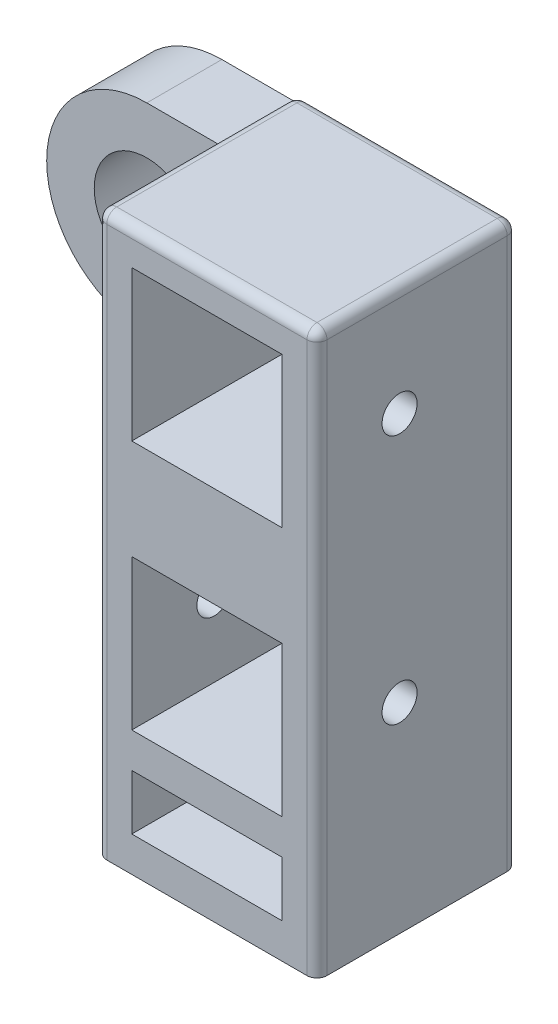
ISO-10303-21;
HEADER;
FILE_DESCRIPTION(('STEP AP214'),'2;1');
FILE_NAME('part.step','',(''),(''),'','','');
FILE_SCHEMA(('AUTOMOTIVE_DESIGN { 1 0 10303 214 1 1 1 1 }'));
ENDSEC;
DATA;
#1=APPLICATION_CONTEXT('core data for automotive mechanical design processes');
#2=APPLICATION_PROTOCOL_DEFINITION('international standard','automotive_design',2000,#1);
#3=PRODUCT_CONTEXT('',#1,'mechanical');
#4=PRODUCT('Part','Part','',(#3));
#5=PRODUCT_RELATED_PRODUCT_CATEGORY('part','',(#4));
#6=PRODUCT_DEFINITION_FORMATION('','',#4);
#7=PRODUCT_DEFINITION_CONTEXT('part definition',#1,'design');
#8=PRODUCT_DEFINITION('design','',#6,#7);
#9=PRODUCT_DEFINITION_SHAPE('','',#8);
#10=(LENGTH_UNIT() NAMED_UNIT(*) SI_UNIT(.MILLI.,.METRE.));
#11=(NAMED_UNIT(*) PLANE_ANGLE_UNIT() SI_UNIT($,.RADIAN.));
#12=(NAMED_UNIT(*) SI_UNIT($,.STERADIAN.) SOLID_ANGLE_UNIT());
#13=UNCERTAINTY_MEASURE_WITH_UNIT(LENGTH_MEASURE(1.E-05),#10,'distance_accuracy_value','');
#14=(GEOMETRIC_REPRESENTATION_CONTEXT(3) GLOBAL_UNCERTAINTY_ASSIGNED_CONTEXT((#13)) GLOBAL_UNIT_ASSIGNED_CONTEXT((#10,
#11,#12)) REPRESENTATION_CONTEXT('',''));
#15=CARTESIAN_POINT('',(0.,0.,0.));
#16=DIRECTION('',(0.,0.,1.));
#17=DIRECTION('',(1.,0.,0.));
#18=AXIS2_PLACEMENT_3D('',#15,#16,#17);
#19=CARTESIAN_POINT('',(-25.096172604143,42.3339477261805,20.));
#20=DIRECTION('',(1.,0.,0.));
#21=DIRECTION('',(0.,0.,-1.));
#22=AXIS2_PLACEMENT_3D('',#19,#20,#21);
#23=PLANE('',#22);
#24=CARTESIAN_POINT('',(-25.096172604143,6.33394772618054,11.75));
#25=DIRECTION('',(-1.,0.,0.));
#26=DIRECTION('',(0.,0.,1.));
#27=AXIS2_PLACEMENT_3D('',#24,#25,#26);
#28=CIRCLE('',#27,1.75);
#29=CARTESIAN_POINT('',(-25.096172604143,6.33394772618054,13.5));
#30=VERTEX_POINT('',#29);
#31=EDGE_CURVE('E354',#30,#30,#28,.T.);
#32=ORIENTED_EDGE('',*,*,#31,.F.);
#33=EDGE_LOOP('',(#32));
#34=FACE_BOUND('',#33,.T.);
#35=DIRECTION('',(0.,0.,-1.));
#36=VECTOR('',#35,1.);
#37=CARTESIAN_POINT('',(-25.096172604143,21.3339477261805,7.5));
#38=LINE('',#37,#36);
#39=CARTESIAN_POINT('',(-25.096172604143,21.3339477261805,7.5));
#40=VERTEX_POINT('',#39);
#41=CARTESIAN_POINT('',(-25.096172604143,21.3339477261805,1.));
#42=VERTEX_POINT('',#41);
#43=EDGE_CURVE('E250',#40,#42,#38,.T.);
#44=ORIENTED_EDGE('',*,*,#43,.T.);
#45=DIRECTION('',(0.,-1.,0.));
#46=VECTOR('',#45,1.);
#47=CARTESIAN_POINT('',(-25.096172604143,42.3339477261805,1.));
#48=LINE('',#47,#46);
#49=CARTESIAN_POINT('',(-25.096172604143,-13.6660522738195,1.));
#50=VERTEX_POINT('',#49);
#51=EDGE_CURVE('E269',#42,#50,#48,.T.);
#52=ORIENTED_EDGE('',*,*,#51,.T.);
#53=DIRECTION('',(0.,0.,-1.));
#54=VECTOR('',#53,1.);
#55=CARTESIAN_POINT('',(-25.096172604143,-13.6660522738195,20.));
#56=LINE('',#55,#54);
#57=CARTESIAN_POINT('',(-25.096172604143,-13.6660522738195,19.));
#58=VERTEX_POINT('',#57);
#59=EDGE_CURVE('E267',#58,#50,#56,.T.);
#60=ORIENTED_EDGE('',*,*,#59,.F.);
#61=DIRECTION('',(0.,-1.,0.));
#62=VECTOR('',#61,1.);
#63=CARTESIAN_POINT('',(-25.096172604143,42.3339477261805,19.));
#64=LINE('',#63,#62);
#65=CARTESIAN_POINT('',(-25.096172604143,41.3339477261805,19.));
#66=VERTEX_POINT('',#65);
#67=EDGE_CURVE('E266',#58,#66,#64,.F.);
#68=ORIENTED_EDGE('',*,*,#67,.T.);
#69=DIRECTION('',(0.,0.,-1.));
#70=VECTOR('',#69,1.);
#71=CARTESIAN_POINT('',(-25.096172604143,41.3339477261805,20.));
#72=LINE('',#71,#70);
#73=CARTESIAN_POINT('',(-25.096172604143,41.3339477261805,7.5));
#74=VERTEX_POINT('',#73);
#75=EDGE_CURVE('E264',#66,#74,#72,.T.);
#76=ORIENTED_EDGE('',*,*,#75,.T.);
#77=DIRECTION('',(0.,-1.,0.));
#78=VECTOR('',#77,1.);
#79=CARTESIAN_POINT('',(-25.096172604143,41.3339477261805,7.5));
#80=LINE('',#79,#78);
#81=EDGE_CURVE('E231',#74,#40,#80,.T.);
#82=ORIENTED_EDGE('',*,*,#81,.T.);
#83=EDGE_LOOP('',(#44,#52,#60,#68,#76,#82));
#84=FACE_BOUND('',#83,.T.);
#85=ADVANCED_FACE('F35',(#34,#84),#23,.F.);
#86=CARTESIAN_POINT('',(0.,0.,20.));
#87=DIRECTION('',(0.,0.,1.));
#88=DIRECTION('',(1.,0.,0.));
#89=AXIS2_PLACEMENT_3D('',#86,#87,#88);
#90=PLANE('',#89);
#91=DIRECTION('',(1.,0.,0.));
#92=VECTOR('',#91,1.);
#93=CARTESIAN_POINT('',(-25.096172604143,-13.6660522738195,20.));
#94=LINE('',#93,#92);
#95=CARTESIAN_POINT('',(-24.096172604143,-13.6660522738195,20.));
#96=VERTEX_POINT('',#95);
#97=CARTESIAN_POINT('',(-4.09617260414296,-13.6660522738195,20.));
#98=VERTEX_POINT('',#97);
#99=EDGE_CURVE('E452',#96,#98,#94,.T.);
#100=ORIENTED_EDGE('',*,*,#99,.T.);
#101=DIRECTION('',(0.,1.,0.));
#102=VECTOR('',#101,1.);
#103=CARTESIAN_POINT('',(-4.09617260414297,42.3339477261805,20.));
#104=LINE('',#103,#102);
#105=CARTESIAN_POINT('',(-4.09617260414297,41.3339477261805,20.));
#106=VERTEX_POINT('',#105);
#107=EDGE_CURVE('E298',#98,#106,#104,.T.);
#108=ORIENTED_EDGE('',*,*,#107,.T.);
#109=DIRECTION('',(-1.,0.,0.));
#110=VECTOR('',#109,1.);
#111=CARTESIAN_POINT('',(-25.096172604143,41.3339477261805,20.));
#112=LINE('',#111,#110);
#113=CARTESIAN_POINT('',(-24.096172604143,41.3339477261805,20.));
#114=VERTEX_POINT('',#113);
#115=EDGE_CURVE('E294',#106,#114,#112,.T.);
#116=ORIENTED_EDGE('',*,*,#115,.T.);
#117=DIRECTION('',(0.,-1.,0.));
#118=VECTOR('',#117,1.);
#119=CARTESIAN_POINT('',(-24.096172604143,-13.6660522738195,20.));
#120=LINE('',#119,#118);
#121=EDGE_CURVE('E296',#114,#96,#120,.T.);
#122=ORIENTED_EDGE('',*,*,#121,.T.);
#123=EDGE_LOOP('',(#100,#108,#116,#122));
#124=FACE_BOUND('',#123,.T.);
#125=DIRECTION('',(0.,-1.,0.));
#126=VECTOR('',#125,1.);
#127=CARTESIAN_POINT('',(-21.596172604143,-4.66605227381946,20.));
#128=LINE('',#127,#126);
#129=CARTESIAN_POINT('',(-21.596172604143,-4.66605227381946,20.));
#130=VERTEX_POINT('',#129);
#131=CARTESIAN_POINT('',(-21.596172604143,-10.1660522738195,20.));
#132=VERTEX_POINT('',#131);
#133=EDGE_CURVE('E249',#130,#132,#128,.T.);
#134=ORIENTED_EDGE('',*,*,#133,.F.);
#135=DIRECTION('',(-1.,0.,0.));
#136=VECTOR('',#135,1.);
#137=CARTESIAN_POINT('',(-21.596172604143,-4.66605227381946,20.));
#138=LINE('',#137,#136);
#139=CARTESIAN_POINT('',(-6.59617260414296,-4.66605227381946,20.));
#140=VERTEX_POINT('',#139);
#141=EDGE_CURVE('E650',#140,#130,#138,.T.);
#142=ORIENTED_EDGE('',*,*,#141,.F.);
#143=DIRECTION('',(0.,1.,0.));
#144=VECTOR('',#143,1.);
#145=CARTESIAN_POINT('',(-6.59617260414296,-4.66605227381946,20.));
#146=LINE('',#145,#144);
#147=CARTESIAN_POINT('',(-6.59617260414296,-10.1660522738195,20.));
#148=VERTEX_POINT('',#147);
#149=EDGE_CURVE('E659',#148,#140,#146,.T.);
#150=ORIENTED_EDGE('',*,*,#149,.F.);
#151=DIRECTION('',(1.,0.,0.));
#152=VECTOR('',#151,1.);
#153=CARTESIAN_POINT('',(-21.596172604143,-10.1660522738195,20.));
#154=LINE('',#153,#152);
#155=EDGE_CURVE('E662',#132,#148,#154,.T.);
#156=ORIENTED_EDGE('',*,*,#155,.F.);
#157=EDGE_LOOP('',(#134,#142,#150,#156));
#158=FACE_BOUND('',#157,.T.);
#159=DIRECTION('',(0.,-1.,0.));
#160=VECTOR('',#159,1.);
#161=CARTESIAN_POINT('',(-21.596172604143,13.8339477261805,20.));
#162=LINE('',#161,#160);
#163=CARTESIAN_POINT('',(-21.596172604143,13.8339477261805,20.));
#164=VERTEX_POINT('',#163);
#165=CARTESIAN_POINT('',(-21.596172604143,-1.16605227381946,20.));
#166=VERTEX_POINT('',#165);
#167=EDGE_CURVE('E637',#164,#166,#162,.T.);
#168=ORIENTED_EDGE('',*,*,#167,.F.);
#169=DIRECTION('',(-1.,0.,0.));
#170=VECTOR('',#169,1.);
#171=CARTESIAN_POINT('',(-21.596172604143,13.8339477261805,20.));
#172=LINE('',#171,#170);
#173=CARTESIAN_POINT('',(-6.59617260414296,13.8339477261805,20.));
#174=VERTEX_POINT('',#173);
#175=EDGE_CURVE('E622',#174,#164,#172,.T.);
#176=ORIENTED_EDGE('',*,*,#175,.F.);
#177=DIRECTION('',(0.,1.,0.));
#178=VECTOR('',#177,1.);
#179=CARTESIAN_POINT('',(-6.59617260414296,13.8339477261805,20.));
#180=LINE('',#179,#178);
#181=CARTESIAN_POINT('',(-6.59617260414296,-1.16605227381946,20.));
#182=VERTEX_POINT('',#181);
#183=EDGE_CURVE('E631',#182,#174,#180,.T.);
#184=ORIENTED_EDGE('',*,*,#183,.F.);
#185=DIRECTION('',(1.,0.,0.));
#186=VECTOR('',#185,1.);
#187=CARTESIAN_POINT('',(-21.596172604143,-1.16605227381946,20.));
#188=LINE('',#187,#186);
#189=EDGE_CURVE('E634',#166,#182,#188,.T.);
#190=ORIENTED_EDGE('',*,*,#189,.F.);
#191=EDGE_LOOP('',(#168,#176,#184,#190));
#192=FACE_BOUND('',#191,.T.);
#193=DIRECTION('',(1.,0.,0.));
#194=VECTOR('',#193,1.);
#195=CARTESIAN_POINT('',(-21.596172604143,23.8339477261805,20.));
#196=LINE('',#195,#194);
#197=CARTESIAN_POINT('',(-21.596172604143,23.8339477261805,20.));
#198=VERTEX_POINT('',#197);
#199=CARTESIAN_POINT('',(-6.59617260414296,23.8339477261805,20.));
#200=VERTEX_POINT('',#199);
#201=EDGE_CURVE('E614',#198,#200,#196,.T.);
#202=ORIENTED_EDGE('',*,*,#201,.F.);
#203=DIRECTION('',(0.,-1.,0.));
#204=VECTOR('',#203,1.);
#205=CARTESIAN_POINT('',(-21.596172604143,38.8339477261805,20.));
#206=LINE('',#205,#204);
#207=CARTESIAN_POINT('',(-21.596172604143,38.8339477261805,20.));
#208=VERTEX_POINT('',#207);
#209=EDGE_CURVE('E591',#208,#198,#206,.T.);
#210=ORIENTED_EDGE('',*,*,#209,.F.);
#211=DIRECTION('',(-1.,0.,0.));
#212=VECTOR('',#211,1.);
#213=CARTESIAN_POINT('',(-21.596172604143,38.8339477261805,20.));
#214=LINE('',#213,#212);
#215=CARTESIAN_POINT('',(-6.59617260414297,38.8339477261805,20.));
#216=VERTEX_POINT('',#215);
#217=EDGE_CURVE('E600',#216,#208,#214,.T.);
#218=ORIENTED_EDGE('',*,*,#217,.F.);
#219=DIRECTION('',(0.,1.,0.));
#220=VECTOR('',#219,1.);
#221=CARTESIAN_POINT('',(-6.59617260414297,38.8339477261805,20.));
#222=LINE('',#221,#220);
#223=EDGE_CURVE('E611',#200,#216,#222,.T.);
#224=ORIENTED_EDGE('',*,*,#223,.F.);
#225=EDGE_LOOP('',(#202,#210,#218,#224));
#226=FACE_BOUND('',#225,.T.);
#227=ADVANCED_FACE('F367',(#124,#158,#192,#226),#90,.T.);
#228=CARTESIAN_POINT('',(0.,0.,0.));
#229=DIRECTION('',(0.,0.,1.));
#230=DIRECTION('',(1.,0.,0.));
#231=AXIS2_PLACEMENT_3D('',#228,#229,#230);
#232=PLANE('',#231);
#233=DIRECTION('',(1.,0.,0.));
#234=VECTOR('',#233,1.);
#235=CARTESIAN_POINT('',(-25.096172604143,-13.6660522738195,0.));
#236=LINE('',#235,#234);
#237=CARTESIAN_POINT('',(-24.096172604143,-13.6660522738195,0.));
#238=VERTEX_POINT('',#237);
#239=CARTESIAN_POINT('',(-4.09617260414296,-13.6660522738195,0.));
#240=VERTEX_POINT('',#239);
#241=EDGE_CURVE('E458',#238,#240,#236,.T.);
#242=ORIENTED_EDGE('',*,*,#241,.F.);
#243=DIRECTION('',(0.,-1.,0.));
#244=VECTOR('',#243,1.);
#245=CARTESIAN_POINT('',(-24.096172604143,0.,0.));
#246=LINE('',#245,#244);
#247=CARTESIAN_POINT('',(-24.096172604143,21.3339477261805,0.));
#248=VERTEX_POINT('',#247);
#249=EDGE_CURVE('E284',#238,#248,#246,.F.);
#250=ORIENTED_EDGE('',*,*,#249,.T.);
#251=DIRECTION('',(-1.,0.,0.));
#252=VECTOR('',#251,1.);
#253=CARTESIAN_POINT('',(-25.096172604143,21.3339477261805,0.));
#254=LINE('',#253,#252);
#255=CARTESIAN_POINT('',(-32.596172604143,21.3339477261805,0.));
#256=VERTEX_POINT('',#255);
#257=EDGE_CURVE('E235',#248,#256,#254,.T.);
#258=ORIENTED_EDGE('',*,*,#257,.T.);
#259=CARTESIAN_POINT('',(-32.596172604143,31.3339477261805,0.));
#260=DIRECTION('',(0.,0.,-1.));
#261=DIRECTION('',(-1.,0.,0.));
#262=AXIS2_PLACEMENT_3D('',#259,#260,#261);
#263=CIRCLE('',#262,10.);
#264=CARTESIAN_POINT('',(-32.596172604143,41.3339477261805,0.));
#265=VERTEX_POINT('',#264);
#266=EDGE_CURVE('E245',#256,#265,#263,.T.);
#267=ORIENTED_EDGE('',*,*,#266,.T.);
#268=DIRECTION('',(1.,0.,0.));
#269=VECTOR('',#268,1.);
#270=CARTESIAN_POINT('',(-32.596172604143,41.3339477261805,0.));
#271=LINE('',#270,#269);
#272=CARTESIAN_POINT('',(-24.096172604143,41.3339477261805,0.));
#273=VERTEX_POINT('',#272);
#274=EDGE_CURVE('E215',#265,#273,#271,.T.);
#275=ORIENTED_EDGE('',*,*,#274,.T.);
#276=DIRECTION('',(-1.,0.,0.));
#277=VECTOR('',#276,1.);
#278=CARTESIAN_POINT('',(0.,41.3339477261805,0.));
#279=LINE('',#278,#277);
#280=CARTESIAN_POINT('',(-4.09617260414297,41.3339477261805,0.));
#281=VERTEX_POINT('',#280);
#282=EDGE_CURVE('E280',#273,#281,#279,.F.);
#283=ORIENTED_EDGE('',*,*,#282,.T.);
#284=DIRECTION('',(0.,1.,0.));
#285=VECTOR('',#284,1.);
#286=CARTESIAN_POINT('',(-4.09617260414296,0.,0.));
#287=LINE('',#286,#285);
#288=EDGE_CURVE('E282',#281,#240,#287,.F.);
#289=ORIENTED_EDGE('',*,*,#288,.T.);
#290=EDGE_LOOP('',(#242,#250,#258,#267,#275,#283,#289));
#291=FACE_BOUND('',#290,.T.);
#292=DIRECTION('',(0.,-1.,0.));
#293=VECTOR('',#292,1.);
#294=CARTESIAN_POINT('',(-21.596172604143,38.8339477261805,0.));
#295=LINE('',#294,#293);
#296=CARTESIAN_POINT('',(-21.596172604143,38.8339477261805,0.));
#297=VERTEX_POINT('',#296);
#298=CARTESIAN_POINT('',(-21.596172604143,23.8339477261805,0.));
#299=VERTEX_POINT('',#298);
#300=EDGE_CURVE('E586',#297,#299,#295,.T.);
#301=ORIENTED_EDGE('',*,*,#300,.T.);
#302=DIRECTION('',(1.,0.,0.));
#303=VECTOR('',#302,1.);
#304=CARTESIAN_POINT('',(-21.596172604143,23.8339477261805,0.));
#305=LINE('',#304,#303);
#306=CARTESIAN_POINT('',(-6.59617260414296,23.8339477261805,0.));
#307=VERTEX_POINT('',#306);
#308=EDGE_CURVE('E577',#299,#307,#305,.T.);
#309=ORIENTED_EDGE('',*,*,#308,.T.);
#310=DIRECTION('',(0.,1.,0.));
#311=VECTOR('',#310,1.);
#312=CARTESIAN_POINT('',(-6.59617260414297,38.8339477261805,0.));
#313=LINE('',#312,#311);
#314=CARTESIAN_POINT('',(-6.59617260414297,38.8339477261805,0.));
#315=VERTEX_POINT('',#314);
#316=EDGE_CURVE('E585',#307,#315,#313,.T.);
#317=ORIENTED_EDGE('',*,*,#316,.T.);
#318=DIRECTION('',(-1.,0.,0.));
#319=VECTOR('',#318,1.);
#320=CARTESIAN_POINT('',(-21.596172604143,38.8339477261805,0.));
#321=LINE('',#320,#319);
#322=EDGE_CURVE('E594',#315,#297,#321,.T.);
#323=ORIENTED_EDGE('',*,*,#322,.T.);
#324=EDGE_LOOP('',(#301,#309,#317,#323));
#325=FACE_BOUND('',#324,.T.);
#326=CARTESIAN_POINT('',(-32.596172604143,31.3339477261805,0.));
#327=DIRECTION('',(0.,0.,-1.));
#328=DIRECTION('',(-1.,0.,0.));
#329=AXIS2_PLACEMENT_3D('',#326,#327,#328);
#330=CIRCLE('',#329,5.25);
#331=CARTESIAN_POINT('',(-37.846172604143,31.3339477261805,0.));
#332=VERTEX_POINT('',#331);
#333=EDGE_CURVE('E240',#332,#332,#330,.T.);
#334=ORIENTED_EDGE('',*,*,#333,.F.);
#335=EDGE_LOOP('',(#334));
#336=FACE_BOUND('',#335,.T.);
#337=ADVANCED_FACE('F364',(#291,#325,#336),#232,.F.);
#338=CARTESIAN_POINT('',(-25.096172604143,-13.6660522738195,20.));
#339=DIRECTION('',(0.,1.,0.));
#340=DIRECTION('',(0.,0.,1.));
#341=AXIS2_PLACEMENT_3D('',#338,#339,#340);
#342=PLANE('',#341);
#343=ORIENTED_EDGE('',*,*,#59,.T.);
#344=CARTESIAN_POINT('',(-24.096172604143,-13.6660522738195,1.));
#345=DIRECTION('',(0.,1.,0.));
#346=DIRECTION('',(0.,0.,1.));
#347=AXIS2_PLACEMENT_3D('',#344,#345,#346);
#348=CIRCLE('',#347,1.);
#349=EDGE_CURVE('E278',#50,#238,#348,.F.);
#350=ORIENTED_EDGE('',*,*,#349,.T.);
#351=ORIENTED_EDGE('',*,*,#241,.T.);
#352=CARTESIAN_POINT('',(-4.09617260414296,-13.6660522738195,1.));
#353=DIRECTION('',(0.,1.,0.));
#354=DIRECTION('',(0.,0.,1.));
#355=AXIS2_PLACEMENT_3D('',#352,#353,#354);
#356=CIRCLE('',#355,1.);
#357=CARTESIAN_POINT('',(-3.09617260414296,-13.6660522738195,1.));
#358=VERTEX_POINT('',#357);
#359=EDGE_CURVE('E276',#240,#358,#356,.F.);
#360=ORIENTED_EDGE('',*,*,#359,.T.);
#361=DIRECTION('',(0.,0.,-1.));
#362=VECTOR('',#361,1.);
#363=CARTESIAN_POINT('',(-3.09617260414296,-13.6660522738195,20.));
#364=LINE('',#363,#362);
#365=CARTESIAN_POINT('',(-3.09617260414296,-13.6660522738195,19.));
#366=VERTEX_POINT('',#365);
#367=EDGE_CURVE('E457',#366,#358,#364,.T.);
#368=ORIENTED_EDGE('',*,*,#367,.F.);
#369=CARTESIAN_POINT('',(-4.09617260414296,-13.6660522738195,19.));
#370=DIRECTION('',(0.,1.,0.));
#371=DIRECTION('',(0.,0.,1.));
#372=AXIS2_PLACEMENT_3D('',#369,#370,#371);
#373=CIRCLE('',#372,1.);
#374=EDGE_CURVE('E274',#366,#98,#373,.F.);
#375=ORIENTED_EDGE('',*,*,#374,.T.);
#376=ORIENTED_EDGE('',*,*,#99,.F.);
#377=CARTESIAN_POINT('',(-24.096172604143,-13.6660522738195,19.));
#378=DIRECTION('',(0.,1.,0.));
#379=DIRECTION('',(0.,0.,1.));
#380=AXIS2_PLACEMENT_3D('',#377,#378,#379);
#381=CIRCLE('',#380,1.);
#382=EDGE_CURVE('E272',#96,#58,#381,.F.);
#383=ORIENTED_EDGE('',*,*,#382,.T.);
#384=EDGE_LOOP('',(#343,#350,#351,#360,#368,#375,#376,#383));
#385=FACE_BOUND('',#384,.T.);
#386=ADVANCED_FACE('F366',(#385),#342,.F.);
#387=CARTESIAN_POINT('',(-3.09617260414297,42.3339477261805,20.));
#388=DIRECTION('',(-1.,0.,0.));
#389=DIRECTION('',(0.,-1.,0.));
#390=AXIS2_PLACEMENT_3D('',#387,#388,#389);
#391=PLANE('',#390);
#392=CARTESIAN_POINT('',(-3.09617260414296,6.33394772618054,11.75));
#393=DIRECTION('',(1.,0.,0.));
#394=DIRECTION('',(0.,1.,0.));
#395=AXIS2_PLACEMENT_3D('',#392,#393,#394);
#396=CIRCLE('',#395,1.75);
#397=CARTESIAN_POINT('',(-3.09617260414296,8.08394772618054,11.75));
#398=VERTEX_POINT('',#397);
#399=EDGE_CURVE('E344',#398,#398,#396,.T.);
#400=ORIENTED_EDGE('',*,*,#399,.F.);
#401=EDGE_LOOP('',(#400));
#402=FACE_BOUND('',#401,.T.);
#403=CARTESIAN_POINT('',(-3.09617260414296,31.3339477261805,11.75));
#404=DIRECTION('',(1.,0.,0.));
#405=DIRECTION('',(0.,1.,0.));
#406=AXIS2_PLACEMENT_3D('',#403,#404,#405);
#407=CIRCLE('',#406,1.75);
#408=CARTESIAN_POINT('',(-3.09617260414297,33.0839477261805,11.75));
#409=VERTEX_POINT('',#408);
#410=EDGE_CURVE('E341',#409,#409,#407,.T.);
#411=ORIENTED_EDGE('',*,*,#410,.F.);
#412=EDGE_LOOP('',(#411));
#413=FACE_BOUND('',#412,.T.);
#414=ORIENTED_EDGE('',*,*,#367,.T.);
#415=DIRECTION('',(0.,1.,0.));
#416=VECTOR('',#415,1.);
#417=CARTESIAN_POINT('',(-3.09617260414297,42.3339477261805,1.));
#418=LINE('',#417,#416);
#419=CARTESIAN_POINT('',(-3.09617260414297,41.3339477261805,1.));
#420=VERTEX_POINT('',#419);
#421=EDGE_CURVE('E291',#358,#420,#418,.T.);
#422=ORIENTED_EDGE('',*,*,#421,.T.);
#423=DIRECTION('',(0.,0.,-1.));
#424=VECTOR('',#423,1.);
#425=CARTESIAN_POINT('',(-3.09617260414297,41.3339477261805,20.));
#426=LINE('',#425,#424);
#427=CARTESIAN_POINT('',(-3.09617260414297,41.3339477261805,19.));
#428=VERTEX_POINT('',#427);
#429=EDGE_CURVE('E287',#420,#428,#426,.F.);
#430=ORIENTED_EDGE('',*,*,#429,.T.);
#431=DIRECTION('',(0.,1.,0.));
#432=VECTOR('',#431,1.);
#433=CARTESIAN_POINT('',(-3.09617260414296,-13.6660522738195,19.));
#434=LINE('',#433,#432);
#435=EDGE_CURVE('E289',#428,#366,#434,.F.);
#436=ORIENTED_EDGE('',*,*,#435,.T.);
#437=EDGE_LOOP('',(#414,#422,#430,#436));
#438=FACE_BOUND('',#437,.T.);
#439=ADVANCED_FACE('F374',(#402,#413,#438),#391,.F.);
#440=CARTESIAN_POINT('',(-25.096172604143,42.3339477261805,20.));
#441=DIRECTION('',(0.,-1.,0.));
#442=DIRECTION('',(0.,0.,-1.));
#443=AXIS2_PLACEMENT_3D('',#440,#441,#442);
#444=PLANE('',#443);
#445=DIRECTION('',(0.,0.,-1.));
#446=VECTOR('',#445,1.);
#447=CARTESIAN_POINT('',(-24.096172604143,42.3339477261805,20.));
#448=LINE('',#447,#446);
#449=CARTESIAN_POINT('',(-24.096172604143,42.3339477261805,1.));
#450=VERTEX_POINT('',#449);
#451=CARTESIAN_POINT('',(-24.096172604143,42.3339477261805,19.));
#452=VERTEX_POINT('',#451);
#453=EDGE_CURVE('E300',#450,#452,#448,.F.);
#454=ORIENTED_EDGE('',*,*,#453,.T.);
#455=DIRECTION('',(-1.,0.,0.));
#456=VECTOR('',#455,1.);
#457=CARTESIAN_POINT('',(-3.09617260414297,42.3339477261805,19.));
#458=LINE('',#457,#456);
#459=CARTESIAN_POINT('',(-4.09617260414297,42.3339477261805,19.));
#460=VERTEX_POINT('',#459);
#461=EDGE_CURVE('E305',#452,#460,#458,.F.);
#462=ORIENTED_EDGE('',*,*,#461,.T.);
#463=DIRECTION('',(0.,0.,-1.));
#464=VECTOR('',#463,1.);
#465=CARTESIAN_POINT('',(-4.09617260414297,42.3339477261805,20.));
#466=LINE('',#465,#464);
#467=CARTESIAN_POINT('',(-4.09617260414297,42.3339477261805,1.));
#468=VERTEX_POINT('',#467);
#469=EDGE_CURVE('E52',#460,#468,#466,.T.);
#470=ORIENTED_EDGE('',*,*,#469,.T.);
#471=DIRECTION('',(-1.,0.,0.));
#472=VECTOR('',#471,1.);
#473=CARTESIAN_POINT('',(-25.096172604143,42.3339477261805,1.));
#474=LINE('',#473,#472);
#475=EDGE_CURVE('E302',#468,#450,#474,.T.);
#476=ORIENTED_EDGE('',*,*,#475,.T.);
#477=EDGE_LOOP('',(#454,#462,#470,#476));
#478=FACE_BOUND('',#477,.T.);
#479=ADVANCED_FACE('F486',(#478),#444,.F.);
#480=CARTESIAN_POINT('',(-21.596172604143,38.8339477261805,20.));
#481=DIRECTION('',(1.,0.,0.));
#482=DIRECTION('',(0.,1.,0.));
#483=AXIS2_PLACEMENT_3D('',#480,#481,#482);
#484=PLANE('',#483);
#485=ORIENTED_EDGE('',*,*,#300,.F.);
#486=DIRECTION('',(0.,0.,-1.));
#487=VECTOR('',#486,1.);
#488=CARTESIAN_POINT('',(-21.596172604143,38.8339477261805,20.));
#489=LINE('',#488,#487);
#490=EDGE_CURVE('E605',#208,#297,#489,.T.);
#491=ORIENTED_EDGE('',*,*,#490,.F.);
#492=ORIENTED_EDGE('',*,*,#209,.T.);
#493=DIRECTION('',(0.,0.,-1.));
#494=VECTOR('',#493,1.);
#495=CARTESIAN_POINT('',(-21.596172604143,23.8339477261805,20.));
#496=LINE('',#495,#494);
#497=EDGE_CURVE('E463',#198,#299,#496,.T.);
#498=ORIENTED_EDGE('',*,*,#497,.T.);
#499=EDGE_LOOP('',(#485,#491,#492,#498));
#500=FACE_BOUND('',#499,.T.);
#501=ADVANCED_FACE('F488',(#500),#484,.T.);
#502=CARTESIAN_POINT('',(-21.596172604143,23.8339477261805,20.));
#503=DIRECTION('',(0.,1.,0.));
#504=DIRECTION('',(0.,0.,1.));
#505=AXIS2_PLACEMENT_3D('',#502,#503,#504);
#506=PLANE('',#505);
#507=ORIENTED_EDGE('',*,*,#308,.F.);
#508=ORIENTED_EDGE('',*,*,#497,.F.);
#509=ORIENTED_EDGE('',*,*,#201,.T.);
#510=DIRECTION('',(0.,0.,-1.));
#511=VECTOR('',#510,1.);
#512=CARTESIAN_POINT('',(-6.59617260414296,23.8339477261805,20.));
#513=LINE('',#512,#511);
#514=EDGE_CURVE('E581',#200,#307,#513,.T.);
#515=ORIENTED_EDGE('',*,*,#514,.T.);
#516=EDGE_LOOP('',(#507,#508,#509,#515));
#517=FACE_BOUND('',#516,.T.);
#518=ADVANCED_FACE('F493',(#517),#506,.T.);
#519=CARTESIAN_POINT('',(-6.59617260414297,38.8339477261805,20.));
#520=DIRECTION('',(-1.,0.,0.));
#521=DIRECTION('',(0.,-1.,0.));
#522=AXIS2_PLACEMENT_3D('',#519,#520,#521);
#523=PLANE('',#522);
#524=CARTESIAN_POINT('',(-6.59617260414297,31.3339477261805,11.75));
#525=DIRECTION('',(-1.,0.,0.));
#526=DIRECTION('',(0.,-1.,0.));
#527=AXIS2_PLACEMENT_3D('',#524,#525,#526);
#528=CIRCLE('',#527,1.75);
#529=CARTESIAN_POINT('',(-6.59617260414297,29.5839477261805,11.75));
#530=VERTEX_POINT('',#529);
#531=EDGE_CURVE('E311',#530,#530,#528,.T.);
#532=ORIENTED_EDGE('',*,*,#531,.F.);
#533=EDGE_LOOP('',(#532));
#534=FACE_BOUND('',#533,.T.);
#535=ORIENTED_EDGE('',*,*,#316,.F.);
#536=ORIENTED_EDGE('',*,*,#514,.F.);
#537=ORIENTED_EDGE('',*,*,#223,.T.);
#538=DIRECTION('',(0.,0.,-1.));
#539=VECTOR('',#538,1.);
#540=CARTESIAN_POINT('',(-6.59617260414297,38.8339477261805,20.));
#541=LINE('',#540,#539);
#542=EDGE_CURVE('E607',#216,#315,#541,.T.);
#543=ORIENTED_EDGE('',*,*,#542,.T.);
#544=EDGE_LOOP('',(#535,#536,#537,#543));
#545=FACE_BOUND('',#544,.T.);
#546=ADVANCED_FACE('F566',(#534,#545),#523,.T.);
#547=CARTESIAN_POINT('',(-21.596172604143,38.8339477261805,20.));
#548=DIRECTION('',(0.,-1.,0.));
#549=DIRECTION('',(0.,0.,-1.));
#550=AXIS2_PLACEMENT_3D('',#547,#548,#549);
#551=PLANE('',#550);
#552=ORIENTED_EDGE('',*,*,#322,.F.);
#553=ORIENTED_EDGE('',*,*,#542,.F.);
#554=ORIENTED_EDGE('',*,*,#217,.T.);
#555=ORIENTED_EDGE('',*,*,#490,.T.);
#556=EDGE_LOOP('',(#552,#553,#554,#555));
#557=FACE_BOUND('',#556,.T.);
#558=ADVANCED_FACE('F562',(#557),#551,.T.);
#559=CARTESIAN_POINT('',(-21.596172604143,13.8339477261805,-21.2132034355964));
#560=DIRECTION('',(-1.,0.,0.));
#561=DIRECTION('',(0.,-1.,0.));
#562=AXIS2_PLACEMENT_3D('',#559,#560,#561);
#563=PLANE('',#562);
#564=CARTESIAN_POINT('',(-21.596172604143,6.33394772618054,11.75));
#565=DIRECTION('',(-1.,0.,0.));
#566=DIRECTION('',(0.,-1.,0.));
#567=AXIS2_PLACEMENT_3D('',#564,#565,#566);
#568=CIRCLE('',#567,1.75);
#569=CARTESIAN_POINT('',(-21.596172604143,4.58394772618054,11.75));
#570=VERTEX_POINT('',#569);
#571=EDGE_CURVE('E39',#570,#570,#568,.T.);
#572=ORIENTED_EDGE('',*,*,#571,.T.);
#573=EDGE_LOOP('',(#572));
#574=FACE_BOUND('',#573,.T.);
#575=DIRECTION('',(0.,1.,0.));
#576=VECTOR('',#575,1.);
#577=CARTESIAN_POINT('',(-21.596172604143,13.8339477261805,4.5));
#578=LINE('',#577,#576);
#579=CARTESIAN_POINT('',(-21.596172604143,-1.16605227381946,4.5));
#580=VERTEX_POINT('',#579);
#581=CARTESIAN_POINT('',(-21.596172604143,13.8339477261805,4.5));
#582=VERTEX_POINT('',#581);
#583=EDGE_CURVE('E597',#580,#582,#578,.T.);
#584=ORIENTED_EDGE('',*,*,#583,.T.);
#585=DIRECTION('',(0.,0.,1.));
#586=VECTOR('',#585,1.);
#587=CARTESIAN_POINT('',(-21.596172604143,13.8339477261805,-21.2132034355964));
#588=LINE('',#587,#586);
#589=EDGE_CURVE('E626',#582,#164,#588,.T.);
#590=ORIENTED_EDGE('',*,*,#589,.T.);
#591=ORIENTED_EDGE('',*,*,#167,.T.);
#592=DIRECTION('',(0.,0.,1.));
#593=VECTOR('',#592,1.);
#594=CARTESIAN_POINT('',(-21.596172604143,-1.16605227381946,-21.2132034355964));
#595=LINE('',#594,#593);
#596=EDGE_CURVE('E618',#580,#166,#595,.T.);
#597=ORIENTED_EDGE('',*,*,#596,.F.);
#598=EDGE_LOOP('',(#584,#590,#591,#597));
#599=FACE_BOUND('',#598,.T.);
#600=ADVANCED_FACE('F553',(#574,#599),#563,.F.);
#601=CARTESIAN_POINT('',(-21.596172604143,13.8339477261805,-21.2132034355964));
#602=DIRECTION('',(0.,1.,0.));
#603=DIRECTION('',(0.,0.,1.));
#604=AXIS2_PLACEMENT_3D('',#601,#602,#603);
#605=PLANE('',#604);
#606=DIRECTION('',(1.,0.,0.));
#607=VECTOR('',#606,1.);
#608=CARTESIAN_POINT('',(-21.596172604143,13.8339477261805,4.5));
#609=LINE('',#608,#607);
#610=CARTESIAN_POINT('',(-6.59617260414296,13.8339477261805,4.5));
#611=VERTEX_POINT('',#610);
#612=EDGE_CURVE('E641',#582,#611,#609,.T.);
#613=ORIENTED_EDGE('',*,*,#612,.T.);
#614=DIRECTION('',(0.,0.,1.));
#615=VECTOR('',#614,1.);
#616=CARTESIAN_POINT('',(-6.59617260414296,13.8339477261805,-21.2132034355964));
#617=LINE('',#616,#615);
#618=EDGE_CURVE('E624',#611,#174,#617,.T.);
#619=ORIENTED_EDGE('',*,*,#618,.T.);
#620=ORIENTED_EDGE('',*,*,#175,.T.);
#621=ORIENTED_EDGE('',*,*,#589,.F.);
#622=EDGE_LOOP('',(#613,#619,#620,#621));
#623=FACE_BOUND('',#622,.T.);
#624=ADVANCED_FACE('F549',(#623),#605,.F.);
#625=CARTESIAN_POINT('',(-6.59617260414296,13.8339477261805,-21.2132034355964));
#626=DIRECTION('',(1.,0.,0.));
#627=DIRECTION('',(0.,1.,0.));
#628=AXIS2_PLACEMENT_3D('',#625,#626,#627);
#629=PLANE('',#628);
#630=CARTESIAN_POINT('',(-6.59617260414296,6.33394772618054,11.75));
#631=DIRECTION('',(1.,0.,0.));
#632=DIRECTION('',(0.,1.,0.));
#633=AXIS2_PLACEMENT_3D('',#630,#631,#632);
#634=CIRCLE('',#633,1.75);
#635=CARTESIAN_POINT('',(-6.59617260414296,8.08394772618054,11.75));
#636=VERTEX_POINT('',#635);
#637=EDGE_CURVE('E342',#636,#636,#634,.T.);
#638=ORIENTED_EDGE('',*,*,#637,.T.);
#639=EDGE_LOOP('',(#638));
#640=FACE_BOUND('',#639,.T.);
#641=DIRECTION('',(0.,-1.,0.));
#642=VECTOR('',#641,1.);
#643=CARTESIAN_POINT('',(-6.59617260414296,13.8339477261805,4.5));
#644=LINE('',#643,#642);
#645=CARTESIAN_POINT('',(-6.59617260414296,-1.16605227381946,4.5));
#646=VERTEX_POINT('',#645);
#647=EDGE_CURVE('E628',#611,#646,#644,.T.);
#648=ORIENTED_EDGE('',*,*,#647,.T.);
#649=DIRECTION('',(0.,0.,1.));
#650=VECTOR('',#649,1.);
#651=CARTESIAN_POINT('',(-6.59617260414296,-1.16605227381946,-21.2132034355964));
#652=LINE('',#651,#650);
#653=EDGE_CURVE('E621',#646,#182,#652,.T.);
#654=ORIENTED_EDGE('',*,*,#653,.T.);
#655=ORIENTED_EDGE('',*,*,#183,.T.);
#656=ORIENTED_EDGE('',*,*,#618,.F.);
#657=EDGE_LOOP('',(#648,#654,#655,#656));
#658=FACE_BOUND('',#657,.T.);
#659=ADVANCED_FACE('F552',(#640,#658),#629,.F.);
#660=CARTESIAN_POINT('',(-21.596172604143,-1.16605227381946,-21.2132034355964));
#661=DIRECTION('',(0.,-1.,0.));
#662=DIRECTION('',(0.,0.,-1.));
#663=AXIS2_PLACEMENT_3D('',#660,#661,#662);
#664=PLANE('',#663);
#665=DIRECTION('',(-1.,0.,0.));
#666=VECTOR('',#665,1.);
#667=CARTESIAN_POINT('',(-21.596172604143,-1.16605227381946,4.5));
#668=LINE('',#667,#666);
#669=EDGE_CURVE('E595',#646,#580,#668,.T.);
#670=ORIENTED_EDGE('',*,*,#669,.T.);
#671=ORIENTED_EDGE('',*,*,#596,.T.);
#672=ORIENTED_EDGE('',*,*,#189,.T.);
#673=ORIENTED_EDGE('',*,*,#653,.F.);
#674=EDGE_LOOP('',(#670,#671,#672,#673));
#675=FACE_BOUND('',#674,.T.);
#676=ADVANCED_FACE('F547',(#675),#664,.F.);
#677=CARTESIAN_POINT('',(0.,0.,4.5));
#678=DIRECTION('',(0.,0.,1.));
#679=DIRECTION('',(1.,0.,0.));
#680=AXIS2_PLACEMENT_3D('',#677,#678,#679);
#681=PLANE('',#680);
#682=ORIENTED_EDGE('',*,*,#583,.F.);
#683=ORIENTED_EDGE('',*,*,#669,.F.);
#684=ORIENTED_EDGE('',*,*,#647,.F.);
#685=ORIENTED_EDGE('',*,*,#612,.F.);
#686=EDGE_LOOP('',(#682,#683,#684,#685));
#687=FACE_BOUND('',#686,.T.);
#688=ADVANCED_FACE('F543',(#687),#681,.T.);
#689=CARTESIAN_POINT('',(-21.596172604143,-4.66605227381946,-21.2132034355964));
#690=DIRECTION('',(-1.,0.,0.));
#691=DIRECTION('',(0.,0.,1.));
#692=AXIS2_PLACEMENT_3D('',#689,#690,#691);
#693=PLANE('',#692);
#694=DIRECTION('',(0.,1.,0.));
#695=VECTOR('',#694,1.);
#696=CARTESIAN_POINT('',(-21.596172604143,-4.66605227381946,4.5));
#697=LINE('',#696,#695);
#698=CARTESIAN_POINT('',(-21.596172604143,-10.1660522738195,4.5));
#699=VERTEX_POINT('',#698);
#700=CARTESIAN_POINT('',(-21.596172604143,-4.66605227381946,4.5));
#701=VERTEX_POINT('',#700);
#702=EDGE_CURVE('E645',#699,#701,#697,.T.);
#703=ORIENTED_EDGE('',*,*,#702,.T.);
#704=DIRECTION('',(0.,0.,1.));
#705=VECTOR('',#704,1.);
#706=CARTESIAN_POINT('',(-21.596172604143,-4.66605227381946,-21.2132034355964));
#707=LINE('',#706,#705);
#708=EDGE_CURVE('E654',#701,#130,#707,.T.);
#709=ORIENTED_EDGE('',*,*,#708,.T.);
#710=ORIENTED_EDGE('',*,*,#133,.T.);
#711=DIRECTION('',(0.,0.,1.));
#712=VECTOR('',#711,1.);
#713=CARTESIAN_POINT('',(-21.596172604143,-10.1660522738195,-21.2132034355964));
#714=LINE('',#713,#712);
#715=EDGE_CURVE('E646',#699,#132,#714,.T.);
#716=ORIENTED_EDGE('',*,*,#715,.F.);
#717=EDGE_LOOP('',(#703,#709,#710,#716));
#718=FACE_BOUND('',#717,.T.);
#719=ADVANCED_FACE('F533',(#718),#693,.F.);
#720=CARTESIAN_POINT('',(-21.596172604143,-4.66605227381946,-21.2132034355964));
#721=DIRECTION('',(0.,1.,0.));
#722=DIRECTION('',(0.,0.,1.));
#723=AXIS2_PLACEMENT_3D('',#720,#721,#722);
#724=PLANE('',#723);
#725=DIRECTION('',(1.,0.,0.));
#726=VECTOR('',#725,1.);
#727=CARTESIAN_POINT('',(-21.596172604143,-4.66605227381946,4.5));
#728=LINE('',#727,#726);
#729=CARTESIAN_POINT('',(-6.59617260414296,-4.66605227381946,4.5));
#730=VERTEX_POINT('',#729);
#731=EDGE_CURVE('E667',#701,#730,#728,.T.);
#732=ORIENTED_EDGE('',*,*,#731,.T.);
#733=DIRECTION('',(0.,0.,1.));
#734=VECTOR('',#733,1.);
#735=CARTESIAN_POINT('',(-6.59617260414296,-4.66605227381946,-21.2132034355964));
#736=LINE('',#735,#734);
#737=EDGE_CURVE('E652',#730,#140,#736,.T.);
#738=ORIENTED_EDGE('',*,*,#737,.T.);
#739=ORIENTED_EDGE('',*,*,#141,.T.);
#740=ORIENTED_EDGE('',*,*,#708,.F.);
#741=EDGE_LOOP('',(#732,#738,#739,#740));
#742=FACE_BOUND('',#741,.T.);
#743=ADVANCED_FACE('F529',(#742),#724,.F.);
#744=CARTESIAN_POINT('',(-6.59617260414296,-4.66605227381946,-21.2132034355964));
#745=DIRECTION('',(1.,0.,0.));
#746=DIRECTION('',(0.,1.,0.));
#747=AXIS2_PLACEMENT_3D('',#744,#745,#746);
#748=PLANE('',#747);
#749=DIRECTION('',(0.,-1.,0.));
#750=VECTOR('',#749,1.);
#751=CARTESIAN_POINT('',(-6.59617260414296,-4.66605227381946,4.5));
#752=LINE('',#751,#750);
#753=CARTESIAN_POINT('',(-6.59617260414296,-10.1660522738195,4.5));
#754=VERTEX_POINT('',#753);
#755=EDGE_CURVE('E656',#730,#754,#752,.T.);
#756=ORIENTED_EDGE('',*,*,#755,.T.);
#757=DIRECTION('',(0.,0.,1.));
#758=VECTOR('',#757,1.);
#759=CARTESIAN_POINT('',(-6.59617260414296,-10.1660522738195,-21.2132034355964));
#760=LINE('',#759,#758);
#761=EDGE_CURVE('E649',#754,#148,#760,.T.);
#762=ORIENTED_EDGE('',*,*,#761,.T.);
#763=ORIENTED_EDGE('',*,*,#149,.T.);
#764=ORIENTED_EDGE('',*,*,#737,.F.);
#765=EDGE_LOOP('',(#756,#762,#763,#764));
#766=FACE_BOUND('',#765,.T.);
#767=ADVANCED_FACE('F532',(#766),#748,.F.);
#768=CARTESIAN_POINT('',(-21.596172604143,-10.1660522738195,-21.2132034355964));
#769=DIRECTION('',(0.,-1.,0.));
#770=DIRECTION('',(0.,0.,-1.));
#771=AXIS2_PLACEMENT_3D('',#768,#769,#770);
#772=PLANE('',#771);
#773=DIRECTION('',(-1.,0.,0.));
#774=VECTOR('',#773,1.);
#775=CARTESIAN_POINT('',(-21.596172604143,-10.1660522738195,4.5));
#776=LINE('',#775,#774);
#777=EDGE_CURVE('E639',#754,#699,#776,.T.);
#778=ORIENTED_EDGE('',*,*,#777,.T.);
#779=ORIENTED_EDGE('',*,*,#715,.T.);
#780=ORIENTED_EDGE('',*,*,#155,.T.);
#781=ORIENTED_EDGE('',*,*,#761,.F.);
#782=EDGE_LOOP('',(#778,#779,#780,#781));
#783=FACE_BOUND('',#782,.T.);
#784=ADVANCED_FACE('F527',(#783),#772,.F.);
#785=CARTESIAN_POINT('',(0.,0.,4.5));
#786=DIRECTION('',(0.,0.,1.));
#787=DIRECTION('',(1.,0.,0.));
#788=AXIS2_PLACEMENT_3D('',#785,#786,#787);
#789=PLANE('',#788);
#790=ORIENTED_EDGE('',*,*,#702,.F.);
#791=ORIENTED_EDGE('',*,*,#777,.F.);
#792=ORIENTED_EDGE('',*,*,#755,.F.);
#793=ORIENTED_EDGE('',*,*,#731,.F.);
#794=EDGE_LOOP('',(#790,#791,#792,#793));
#795=FACE_BOUND('',#794,.T.);
#796=ADVANCED_FACE('F524',(#795),#789,.T.);
#797=CARTESIAN_POINT('',(-32.596172604143,31.3339477261805,7.5));
#798=DIRECTION('',(0.,0.,-1.));
#799=DIRECTION('',(-1.,0.,0.));
#800=AXIS2_PLACEMENT_3D('',#797,#798,#799);
#801=CYLINDRICAL_SURFACE('',#800,10.);
#802=ORIENTED_EDGE('',*,*,#266,.F.);
#803=DIRECTION('',(0.,0.,-1.));
#804=VECTOR('',#803,1.);
#805=CARTESIAN_POINT('',(-32.596172604143,21.3339477261805,7.5));
#806=LINE('',#805,#804);
#807=CARTESIAN_POINT('',(-32.596172604143,21.3339477261805,7.5));
#808=VERTEX_POINT('',#807);
#809=EDGE_CURVE('E234',#808,#256,#806,.T.);
#810=ORIENTED_EDGE('',*,*,#809,.F.);
#811=CARTESIAN_POINT('',(-32.596172604143,31.3339477261805,7.5));
#812=DIRECTION('',(0.,0.,-1.));
#813=DIRECTION('',(-1.,0.,0.));
#814=AXIS2_PLACEMENT_3D('',#811,#812,#813);
#815=CIRCLE('',#814,10.);
#816=CARTESIAN_POINT('',(-32.596172604143,41.3339477261805,7.5));
#817=VERTEX_POINT('',#816);
#818=EDGE_CURVE('E228',#808,#817,#815,.T.);
#819=ORIENTED_EDGE('',*,*,#818,.T.);
#820=DIRECTION('',(0.,0.,-1.));
#821=VECTOR('',#820,1.);
#822=CARTESIAN_POINT('',(-32.596172604143,41.3339477261805,7.5));
#823=LINE('',#822,#821);
#824=EDGE_CURVE('E210',#817,#265,#823,.T.);
#825=ORIENTED_EDGE('',*,*,#824,.T.);
#826=EDGE_LOOP('',(#802,#810,#819,#825));
#827=FACE_BOUND('',#826,.T.);
#828=ADVANCED_FACE('F233',(#827),#801,.T.);
#829=CARTESIAN_POINT('',(-25.096172604143,21.3339477261805,7.5));
#830=DIRECTION('',(0.,-1.,0.));
#831=DIRECTION('',(0.,0.,-1.));
#832=AXIS2_PLACEMENT_3D('',#829,#830,#831);
#833=PLANE('',#832);
#834=ORIENTED_EDGE('',*,*,#257,.F.);
#835=CARTESIAN_POINT('',(-24.096172604143,21.3339477261805,1.));
#836=DIRECTION('',(0.,-1.,0.));
#837=DIRECTION('',(0.,0.,-1.));
#838=AXIS2_PLACEMENT_3D('',#835,#836,#837);
#839=CIRCLE('',#838,1.);
#840=EDGE_CURVE('E44',#248,#42,#839,.F.);
#841=ORIENTED_EDGE('',*,*,#840,.T.);
#842=ORIENTED_EDGE('',*,*,#43,.F.);
#843=DIRECTION('',(-1.,0.,0.));
#844=VECTOR('',#843,1.);
#845=CARTESIAN_POINT('',(-25.096172604143,21.3339477261805,7.5));
#846=LINE('',#845,#844);
#847=EDGE_CURVE('E221',#40,#808,#846,.T.);
#848=ORIENTED_EDGE('',*,*,#847,.T.);
#849=ORIENTED_EDGE('',*,*,#809,.T.);
#850=EDGE_LOOP('',(#834,#841,#842,#848,#849));
#851=FACE_BOUND('',#850,.T.);
#852=ADVANCED_FACE('F474',(#851),#833,.T.);
#853=CARTESIAN_POINT('',(-32.596172604143,41.3339477261805,7.5));
#854=DIRECTION('',(0.,1.,0.));
#855=DIRECTION('',(0.,0.,1.));
#856=AXIS2_PLACEMENT_3D('',#853,#854,#855);
#857=PLANE('',#856);
#858=ORIENTED_EDGE('',*,*,#274,.F.);
#859=ORIENTED_EDGE('',*,*,#824,.F.);
#860=DIRECTION('',(1.,0.,0.));
#861=VECTOR('',#860,1.);
#862=CARTESIAN_POINT('',(-32.596172604143,41.3339477261805,7.5));
#863=LINE('',#862,#861);
#864=EDGE_CURVE('E213',#817,#74,#863,.T.);
#865=ORIENTED_EDGE('',*,*,#864,.T.);
#866=DIRECTION('',(0.,0.,-1.));
#867=VECTOR('',#866,1.);
#868=CARTESIAN_POINT('',(-25.096172604143,41.3339477261805,7.5));
#869=LINE('',#868,#867);
#870=CARTESIAN_POINT('',(-25.096172604143,41.3339477261805,1.));
#871=VERTEX_POINT('',#870);
#872=EDGE_CURVE('E220',#74,#871,#869,.T.);
#873=ORIENTED_EDGE('',*,*,#872,.T.);
#874=CARTESIAN_POINT('',(-24.096172604143,41.3339477261805,1.));
#875=DIRECTION('',(0.,1.,0.));
#876=DIRECTION('',(0.,0.,1.));
#877=AXIS2_PLACEMENT_3D('',#874,#875,#876);
#878=CIRCLE('',#877,1.);
#879=EDGE_CURVE('E12',#871,#273,#878,.F.);
#880=ORIENTED_EDGE('',*,*,#879,.T.);
#881=EDGE_LOOP('',(#858,#859,#865,#873,#880));
#882=FACE_BOUND('',#881,.T.);
#883=ADVANCED_FACE('F212',(#882),#857,.T.);
#884=CARTESIAN_POINT('',(-32.596172604143,31.3339477261805,7.5));
#885=DIRECTION('',(0.,0.,-1.));
#886=DIRECTION('',(-1.,0.,0.));
#887=AXIS2_PLACEMENT_3D('',#884,#885,#886);
#888=PLANE('',#887);
#889=CARTESIAN_POINT('',(-32.596172604143,31.3339477261805,7.5));
#890=DIRECTION('',(0.,0.,-1.));
#891=DIRECTION('',(-1.,0.,0.));
#892=AXIS2_PLACEMENT_3D('',#889,#890,#891);
#893=CIRCLE('',#892,5.25);
#894=CARTESIAN_POINT('',(-37.846172604143,31.3339477261805,7.5));
#895=VERTEX_POINT('',#894);
#896=EDGE_CURVE('E247',#895,#895,#893,.T.);
#897=ORIENTED_EDGE('',*,*,#896,.T.);
#898=EDGE_LOOP('',(#897));
#899=FACE_BOUND('',#898,.T.);
#900=ORIENTED_EDGE('',*,*,#818,.F.);
#901=ORIENTED_EDGE('',*,*,#847,.F.);
#902=ORIENTED_EDGE('',*,*,#81,.F.);
#903=ORIENTED_EDGE('',*,*,#864,.F.);
#904=EDGE_LOOP('',(#900,#901,#902,#903));
#905=FACE_BOUND('',#904,.T.);
#906=ADVANCED_FACE('F226',(#899,#905),#888,.F.);
#907=CARTESIAN_POINT('',(-32.596172604143,31.3339477261805,7.5));
#908=DIRECTION('',(0.,0.,-1.));
#909=DIRECTION('',(-1.,0.,0.));
#910=AXIS2_PLACEMENT_3D('',#907,#908,#909);
#911=CYLINDRICAL_SURFACE('',#910,5.25);
#912=ORIENTED_EDGE('',*,*,#896,.F.);
#913=EDGE_LOOP('',(#912));
#914=FACE_BOUND('',#913,.T.);
#915=ORIENTED_EDGE('',*,*,#333,.T.);
#916=EDGE_LOOP('',(#915));
#917=FACE_BOUND('',#916,.T.);
#918=ADVANCED_FACE('F362',(#914,#917),#911,.F.);
#919=CARTESIAN_POINT('',(-24.096172604143,42.3339477261805,1.));
#920=DIRECTION('',(0.,-1.,0.));
#921=DIRECTION('',(0.,0.,-1.));
#922=AXIS2_PLACEMENT_3D('',#919,#920,#921);
#923=CYLINDRICAL_SURFACE('',#922,1.);
#924=ORIENTED_EDGE('',*,*,#840,.F.);
#925=ORIENTED_EDGE('',*,*,#249,.F.);
#926=ORIENTED_EDGE('',*,*,#349,.F.);
#927=ORIENTED_EDGE('',*,*,#51,.F.);
#928=EDGE_LOOP('',(#924,#925,#926,#927));
#929=FACE_BOUND('',#928,.T.);
#930=ADVANCED_FACE('F391',(#929),#923,.T.);
#931=CARTESIAN_POINT('',(-24.096172604143,0.,19.));
#932=DIRECTION('',(0.,1.,0.));
#933=DIRECTION('',(0.,0.,1.));
#934=AXIS2_PLACEMENT_3D('',#931,#932,#933);
#935=CYLINDRICAL_SURFACE('',#934,1.);
#936=CARTESIAN_POINT('',(-24.096172604143,41.3339477261805,19.));
#937=DIRECTION('',(0.,1.,0.));
#938=DIRECTION('',(0.,0.,1.));
#939=AXIS2_PLACEMENT_3D('',#936,#937,#938);
#940=CIRCLE('',#939,1.);
#941=EDGE_CURVE('E337',#66,#114,#940,.T.);
#942=ORIENTED_EDGE('',*,*,#941,.F.);
#943=ORIENTED_EDGE('',*,*,#67,.F.);
#944=ORIENTED_EDGE('',*,*,#382,.F.);
#945=ORIENTED_EDGE('',*,*,#121,.F.);
#946=EDGE_LOOP('',(#942,#943,#944,#945));
#947=FACE_BOUND('',#946,.T.);
#948=ADVANCED_FACE('F37',(#947),#935,.T.);
#949=CARTESIAN_POINT('',(-24.096172604143,41.3339477261805,19.));
#950=DIRECTION('',(0.,0.,1.));
#951=DIRECTION('',(1.,0.,0.));
#952=AXIS2_PLACEMENT_3D('',#949,#950,#951);
#953=SPHERICAL_SURFACE('',#952,1.);
#954=CARTESIAN_POINT('',(-24.096172604143,41.3339477261805,19.));
#955=DIRECTION('',(0.,0.,1.));
#956=DIRECTION('',(1.,0.,0.));
#957=AXIS2_PLACEMENT_3D('',#954,#955,#956);
#958=CIRCLE('',#957,1.);
#959=EDGE_CURVE('E331',#66,#452,#958,.F.);
#960=ORIENTED_EDGE('',*,*,#959,.F.);
#961=ORIENTED_EDGE('',*,*,#941,.T.);
#962=CARTESIAN_POINT('',(-24.096172604143,41.3339477261805,19.));
#963=DIRECTION('',(-1.,0.,0.));
#964=DIRECTION('',(0.,0.,1.));
#965=AXIS2_PLACEMENT_3D('',#962,#963,#964);
#966=CIRCLE('',#965,1.);
#967=EDGE_CURVE('E334',#452,#114,#966,.F.);
#968=ORIENTED_EDGE('',*,*,#967,.F.);
#969=EDGE_LOOP('',(#960,#961,#968));
#970=FACE_BOUND('',#969,.T.);
#971=ADVANCED_FACE('F429',(#970),#953,.T.);
#972=CARTESIAN_POINT('',(-4.09617260414296,0.,19.));
#973=DIRECTION('',(0.,-1.,0.));
#974=DIRECTION('',(1.,0.,0.));
#975=AXIS2_PLACEMENT_3D('',#972,#973,#974);
#976=CYLINDRICAL_SURFACE('',#975,1.);
#977=ORIENTED_EDGE('',*,*,#374,.F.);
#978=ORIENTED_EDGE('',*,*,#435,.F.);
#979=CARTESIAN_POINT('',(-4.09617260414297,41.3339477261805,19.));
#980=DIRECTION('',(0.,1.,0.));
#981=DIRECTION('',(0.,0.,1.));
#982=AXIS2_PLACEMENT_3D('',#979,#980,#981);
#983=CIRCLE('',#982,1.);
#984=EDGE_CURVE('E328',#106,#428,#983,.T.);
#985=ORIENTED_EDGE('',*,*,#984,.F.);
#986=ORIENTED_EDGE('',*,*,#107,.F.);
#987=EDGE_LOOP('',(#977,#978,#985,#986));
#988=FACE_BOUND('',#987,.T.);
#989=ADVANCED_FACE('F426',(#988),#976,.T.);
#990=CARTESIAN_POINT('',(0.,41.3339477261805,19.));
#991=DIRECTION('',(1.,0.,0.));
#992=DIRECTION('',(0.,0.,-1.));
#993=AXIS2_PLACEMENT_3D('',#990,#991,#992);
#994=CYLINDRICAL_SURFACE('',#993,1.);
#995=ORIENTED_EDGE('',*,*,#967,.T.);
#996=ORIENTED_EDGE('',*,*,#115,.F.);
#997=CARTESIAN_POINT('',(-4.09617260414297,41.3339477261805,19.));
#998=DIRECTION('',(1.,0.,0.));
#999=DIRECTION('',(0.,0.,-1.));
#1000=AXIS2_PLACEMENT_3D('',#997,#998,#999);
#1001=CIRCLE('',#1000,1.);
#1002=EDGE_CURVE('E325',#460,#106,#1001,.T.);
#1003=ORIENTED_EDGE('',*,*,#1002,.F.);
#1004=ORIENTED_EDGE('',*,*,#461,.F.);
#1005=EDGE_LOOP('',(#995,#996,#1003,#1004));
#1006=FACE_BOUND('',#1005,.T.);
#1007=ADVANCED_FACE('F422',(#1006),#994,.T.);
#1008=CARTESIAN_POINT('',(-24.096172604143,41.3339477261805,20.));
#1009=DIRECTION('',(0.,0.,-1.));
#1010=DIRECTION('',(-1.,0.,0.));
#1011=AXIS2_PLACEMENT_3D('',#1008,#1009,#1010);
#1012=CYLINDRICAL_SURFACE('',#1011,1.);
#1013=ORIENTED_EDGE('',*,*,#959,.T.);
#1014=ORIENTED_EDGE('',*,*,#453,.F.);
#1015=CARTESIAN_POINT('',(-24.096172604143,41.3339477261805,1.));
#1016=DIRECTION('',(0.,0.,-1.));
#1017=DIRECTION('',(-1.,0.,0.));
#1018=AXIS2_PLACEMENT_3D('',#1015,#1016,#1017);
#1019=CIRCLE('',#1018,1.);
#1020=EDGE_CURVE('E322',#871,#450,#1019,.T.);
#1021=ORIENTED_EDGE('',*,*,#1020,.F.);
#1022=ORIENTED_EDGE('',*,*,#872,.F.);
#1023=ORIENTED_EDGE('',*,*,#75,.F.);
#1024=EDGE_LOOP('',(#1013,#1014,#1021,#1022,#1023));
#1025=FACE_BOUND('',#1024,.T.);
#1026=ADVANCED_FACE('F418',(#1025),#1012,.T.);
#1027=CARTESIAN_POINT('',(-4.09617260414297,41.3339477261805,19.));
#1028=DIRECTION('',(0.,0.,1.));
#1029=DIRECTION('',(1.,0.,0.));
#1030=AXIS2_PLACEMENT_3D('',#1027,#1028,#1029);
#1031=SPHERICAL_SURFACE('',#1030,1.);
#1032=ORIENTED_EDGE('',*,*,#1002,.T.);
#1033=ORIENTED_EDGE('',*,*,#984,.T.);
#1034=CARTESIAN_POINT('',(-4.09617260414297,41.3339477261805,19.));
#1035=DIRECTION('',(0.,0.,1.));
#1036=DIRECTION('',(1.,0.,0.));
#1037=AXIS2_PLACEMENT_3D('',#1034,#1035,#1036);
#1038=CIRCLE('',#1037,1.);
#1039=EDGE_CURVE('E320',#460,#428,#1038,.F.);
#1040=ORIENTED_EDGE('',*,*,#1039,.F.);
#1041=EDGE_LOOP('',(#1032,#1033,#1040));
#1042=FACE_BOUND('',#1041,.T.);
#1043=ADVANCED_FACE('F414',(#1042),#1031,.T.);
#1044=CARTESIAN_POINT('',(-24.096172604143,41.3339477261805,1.));
#1045=DIRECTION('',(0.,0.,1.));
#1046=DIRECTION('',(1.,0.,0.));
#1047=AXIS2_PLACEMENT_3D('',#1044,#1045,#1046);
#1048=SPHERICAL_SURFACE('',#1047,1.);
#1049=ORIENTED_EDGE('',*,*,#879,.F.);
#1050=ORIENTED_EDGE('',*,*,#1020,.T.);
#1051=CARTESIAN_POINT('',(-24.096172604143,41.3339477261805,1.));
#1052=DIRECTION('',(-1.,0.,0.));
#1053=DIRECTION('',(0.,0.,1.));
#1054=AXIS2_PLACEMENT_3D('',#1051,#1052,#1053);
#1055=CIRCLE('',#1054,1.);
#1056=EDGE_CURVE('E317',#273,#450,#1055,.F.);
#1057=ORIENTED_EDGE('',*,*,#1056,.F.);
#1058=EDGE_LOOP('',(#1049,#1050,#1057));
#1059=FACE_BOUND('',#1058,.T.);
#1060=ADVANCED_FACE('F411',(#1059),#1048,.T.);
#1061=CARTESIAN_POINT('',(-4.09617260414297,41.3339477261805,20.));
#1062=DIRECTION('',(0.,0.,-1.));
#1063=DIRECTION('',(-1.,0.,0.));
#1064=AXIS2_PLACEMENT_3D('',#1061,#1062,#1063);
#1065=CYLINDRICAL_SURFACE('',#1064,1.);
#1066=ORIENTED_EDGE('',*,*,#1039,.T.);
#1067=ORIENTED_EDGE('',*,*,#429,.F.);
#1068=CARTESIAN_POINT('',(-4.09617260414297,41.3339477261805,1.));
#1069=DIRECTION('',(0.,0.,-1.));
#1070=DIRECTION('',(-1.,0.,0.));
#1071=AXIS2_PLACEMENT_3D('',#1068,#1069,#1070);
#1072=CIRCLE('',#1071,1.);
#1073=EDGE_CURVE('E314',#468,#420,#1072,.T.);
#1074=ORIENTED_EDGE('',*,*,#1073,.F.);
#1075=ORIENTED_EDGE('',*,*,#469,.F.);
#1076=EDGE_LOOP('',(#1066,#1067,#1074,#1075));
#1077=FACE_BOUND('',#1076,.T.);
#1078=ADVANCED_FACE('F407',(#1077),#1065,.T.);
#1079=CARTESIAN_POINT('',(-25.096172604143,41.3339477261805,1.));
#1080=DIRECTION('',(-1.,0.,0.));
#1081=DIRECTION('',(0.,0.,1.));
#1082=AXIS2_PLACEMENT_3D('',#1079,#1080,#1081);
#1083=CYLINDRICAL_SURFACE('',#1082,1.);
#1084=ORIENTED_EDGE('',*,*,#1056,.T.);
#1085=ORIENTED_EDGE('',*,*,#475,.F.);
#1086=CARTESIAN_POINT('',(-4.09617260414297,41.3339477261805,1.));
#1087=DIRECTION('',(1.,0.,0.));
#1088=DIRECTION('',(0.,1.,0.));
#1089=AXIS2_PLACEMENT_3D('',#1086,#1087,#1088);
#1090=CIRCLE('',#1089,1.);
#1091=EDGE_CURVE('E310',#281,#468,#1090,.T.);
#1092=ORIENTED_EDGE('',*,*,#1091,.F.);
#1093=ORIENTED_EDGE('',*,*,#282,.F.);
#1094=EDGE_LOOP('',(#1084,#1085,#1092,#1093));
#1095=FACE_BOUND('',#1094,.T.);
#1096=ADVANCED_FACE('F403',(#1095),#1083,.T.);
#1097=CARTESIAN_POINT('',(-4.09617260414297,41.3339477261805,1.));
#1098=DIRECTION('',(0.,0.,1.));
#1099=DIRECTION('',(1.,0.,0.));
#1100=AXIS2_PLACEMENT_3D('',#1097,#1098,#1099);
#1101=SPHERICAL_SURFACE('',#1100,1.);
#1102=ORIENTED_EDGE('',*,*,#1091,.T.);
#1103=ORIENTED_EDGE('',*,*,#1073,.T.);
#1104=CARTESIAN_POINT('',(-4.09617260414297,41.3339477261805,1.));
#1105=DIRECTION('',(0.,1.,0.));
#1106=DIRECTION('',(0.,0.,1.));
#1107=AXIS2_PLACEMENT_3D('',#1104,#1105,#1106);
#1108=CIRCLE('',#1107,1.);
#1109=EDGE_CURVE('E308',#281,#420,#1108,.F.);
#1110=ORIENTED_EDGE('',*,*,#1109,.F.);
#1111=EDGE_LOOP('',(#1102,#1103,#1110));
#1112=FACE_BOUND('',#1111,.T.);
#1113=ADVANCED_FACE('F399',(#1112),#1101,.T.);
#1114=CARTESIAN_POINT('',(-4.09617260414297,42.3339477261805,1.));
#1115=DIRECTION('',(0.,1.,0.));
#1116=DIRECTION('',(-1.,0.,0.));
#1117=AXIS2_PLACEMENT_3D('',#1114,#1115,#1116);
#1118=CYLINDRICAL_SURFACE('',#1117,1.);
#1119=ORIENTED_EDGE('',*,*,#359,.F.);
#1120=ORIENTED_EDGE('',*,*,#288,.F.);
#1121=ORIENTED_EDGE('',*,*,#1109,.T.);
#1122=ORIENTED_EDGE('',*,*,#421,.F.);
#1123=EDGE_LOOP('',(#1119,#1120,#1121,#1122));
#1124=FACE_BOUND('',#1123,.T.);
#1125=ADVANCED_FACE('F395',(#1124),#1118,.T.);
#1126=CARTESIAN_POINT('',(-13.096172604143,31.3339477261805,11.75));
#1127=DIRECTION('',(1.,0.,0.));
#1128=DIRECTION('',(0.,1.,0.));
#1129=AXIS2_PLACEMENT_3D('',#1126,#1127,#1128);
#1130=CYLINDRICAL_SURFACE('',#1129,1.75);
#1131=ORIENTED_EDGE('',*,*,#531,.T.);
#1132=EDGE_LOOP('',(#1131));
#1133=FACE_BOUND('',#1132,.T.);
#1134=ORIENTED_EDGE('',*,*,#410,.T.);
#1135=EDGE_LOOP('',(#1134));
#1136=FACE_BOUND('',#1135,.T.);
#1137=ADVANCED_FACE('F398',(#1133,#1136),#1130,.F.);
#1138=CARTESIAN_POINT('',(-13.096172604143,6.33394772618054,11.75));
#1139=DIRECTION('',(1.,0.,0.));
#1140=DIRECTION('',(0.,1.,0.));
#1141=AXIS2_PLACEMENT_3D('',#1138,#1139,#1140);
#1142=CYLINDRICAL_SURFACE('',#1141,1.75);
#1143=ORIENTED_EDGE('',*,*,#399,.T.);
#1144=EDGE_LOOP('',(#1143));
#1145=FACE_BOUND('',#1144,.T.);
#1146=ORIENTED_EDGE('',*,*,#637,.F.);
#1147=EDGE_LOOP('',(#1146));
#1148=FACE_BOUND('',#1147,.T.);
#1149=ADVANCED_FACE('F503',(#1145,#1148),#1142,.F.);
#1150=CARTESIAN_POINT('',(-15.096172604143,6.33394772618054,11.75));
#1151=DIRECTION('',(-1.,0.,0.));
#1152=DIRECTION('',(0.,0.,1.));
#1153=AXIS2_PLACEMENT_3D('',#1150,#1151,#1152);
#1154=CYLINDRICAL_SURFACE('',#1153,1.75);
#1155=ORIENTED_EDGE('',*,*,#31,.T.);
#1156=EDGE_LOOP('',(#1155));
#1157=FACE_BOUND('',#1156,.T.);
#1158=ORIENTED_EDGE('',*,*,#571,.F.);
#1159=EDGE_LOOP('',(#1158));
#1160=FACE_BOUND('',#1159,.T.);
#1161=ADVANCED_FACE('F509',(#1157,#1160),#1154,.F.);
#1162=CLOSED_SHELL('',(#85,#227,#337,#386,#439,#479,#501,#518,#546,#558,#600,#624,#659,#676,
#688,#719,#743,#767,#784,#796,#828,#852,#883,#906,#918,#930,#948,#971,#989,#1007,#1026,#1043,
#1060,#1078,#1096,#1113,#1125,#1137,#1149,#1161));
#1163=MANIFOLD_SOLID_BREP('B2',#1162);
#1164=ADVANCED_BREP_SHAPE_REPRESENTATION('',(#18,#1163),#14);
#1165=SHAPE_DEFINITION_REPRESENTATION(#9,#1164);
ENDSEC;
END-ISO-10303-21;
